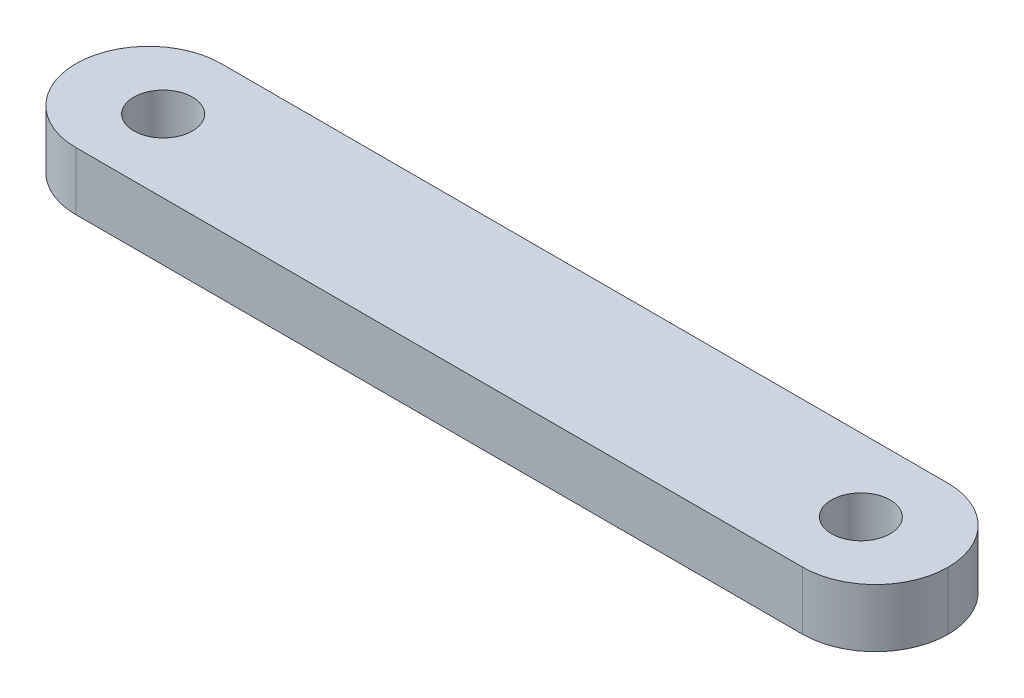
ISO-10303-21;
HEADER;
FILE_DESCRIPTION(('STEP AP214'),'2;1');
FILE_NAME('part.step','',(''),(''),'','','');
FILE_SCHEMA(('AUTOMOTIVE_DESIGN { 1 0 10303 214 1 1 1 1 }'));
ENDSEC;
DATA;
#1=APPLICATION_CONTEXT('core data for automotive mechanical design processes');
#2=APPLICATION_PROTOCOL_DEFINITION('international standard','automotive_design',2000,#1);
#3=PRODUCT_CONTEXT('',#1,'mechanical');
#4=PRODUCT('Part','Part','',(#3));
#5=PRODUCT_RELATED_PRODUCT_CATEGORY('part','',(#4));
#6=PRODUCT_DEFINITION_FORMATION('','',#4);
#7=PRODUCT_DEFINITION_CONTEXT('part definition',#1,'design');
#8=PRODUCT_DEFINITION('design','',#6,#7);
#9=PRODUCT_DEFINITION_SHAPE('','',#8);
#10=(LENGTH_UNIT() NAMED_UNIT(*) SI_UNIT(.MILLI.,.METRE.));
#11=(NAMED_UNIT(*) PLANE_ANGLE_UNIT() SI_UNIT($,.RADIAN.));
#12=(NAMED_UNIT(*) SI_UNIT($,.STERADIAN.) SOLID_ANGLE_UNIT());
#13=UNCERTAINTY_MEASURE_WITH_UNIT(LENGTH_MEASURE(1.E-05),#10,'distance_accuracy_value','');
#14=(GEOMETRIC_REPRESENTATION_CONTEXT(3) GLOBAL_UNCERTAINTY_ASSIGNED_CONTEXT((#13)) GLOBAL_UNIT_ASSIGNED_CONTEXT((#10,
#11,#12)) REPRESENTATION_CONTEXT('',''));
#15=CARTESIAN_POINT('',(0.,0.,0.));
#16=DIRECTION('',(0.,0.,1.));
#17=DIRECTION('',(1.,0.,0.));
#18=AXIS2_PLACEMENT_3D('',#15,#16,#17);
#19=CARTESIAN_POINT('',(-75.,10.,12.5));
#20=DIRECTION('',(0.,0.,-1.));
#21=DIRECTION('',(-1.,0.,0.));
#22=AXIS2_PLACEMENT_3D('',#19,#20,#21);
#23=PLANE('',#22);
#24=DIRECTION('',(1.,0.,0.));
#25=VECTOR('',#24,1.);
#26=CARTESIAN_POINT('',(-75.,0.,12.5));
#27=LINE('',#26,#25);
#28=CARTESIAN_POINT('',(-62.5,0.,12.5));
#29=VERTEX_POINT('',#28);
#30=CARTESIAN_POINT('',(62.5,0.,12.5));
#31=VERTEX_POINT('',#30);
#32=EDGE_CURVE('E94',#29,#31,#27,.T.);
#33=ORIENTED_EDGE('',*,*,#32,.T.);
#34=DIRECTION('',(0.,-1.,0.));
#35=VECTOR('',#34,1.);
#36=CARTESIAN_POINT('',(62.5,10.,12.5));
#37=LINE('',#36,#35);
#38=CARTESIAN_POINT('',(62.5,10.,12.5));
#39=VERTEX_POINT('',#38);
#40=EDGE_CURVE('E126',#31,#39,#37,.F.);
#41=ORIENTED_EDGE('',*,*,#40,.T.);
#42=DIRECTION('',(1.,0.,0.));
#43=VECTOR('',#42,1.);
#44=CARTESIAN_POINT('',(-75.,10.,12.5));
#45=LINE('',#44,#43);
#46=CARTESIAN_POINT('',(-62.5,10.,12.5));
#47=VERTEX_POINT('',#46);
#48=EDGE_CURVE('E136',#47,#39,#45,.T.);
#49=ORIENTED_EDGE('',*,*,#48,.F.);
#50=DIRECTION('',(0.,-1.,0.));
#51=VECTOR('',#50,1.);
#52=CARTESIAN_POINT('',(-62.5,10.,12.5));
#53=LINE('',#52,#51);
#54=EDGE_CURVE('E129',#47,#29,#53,.T.);
#55=ORIENTED_EDGE('',*,*,#54,.T.);
#56=EDGE_LOOP('',(#33,#41,#49,#55));
#57=FACE_BOUND('',#56,.T.);
#58=ADVANCED_FACE('F35',(#57),#23,.F.);
#59=CARTESIAN_POINT('',(-75.,10.,-12.5));
#60=DIRECTION('',(0.,0.,1.));
#61=DIRECTION('',(1.,0.,0.));
#62=AXIS2_PLACEMENT_3D('',#59,#60,#61);
#63=PLANE('',#62);
#64=DIRECTION('',(-1.,0.,0.));
#65=VECTOR('',#64,1.);
#66=CARTESIAN_POINT('',(-75.,10.,-12.5));
#67=LINE('',#66,#65);
#68=CARTESIAN_POINT('',(62.5,10.,-12.5));
#69=VERTEX_POINT('',#68);
#70=CARTESIAN_POINT('',(-62.5,10.,-12.5));
#71=VERTEX_POINT('',#70);
#72=EDGE_CURVE('E105',#69,#71,#67,.T.);
#73=ORIENTED_EDGE('',*,*,#72,.F.);
#74=DIRECTION('',(0.,-1.,0.));
#75=VECTOR('',#74,1.);
#76=CARTESIAN_POINT('',(62.5,10.,-12.5));
#77=LINE('',#76,#75);
#78=CARTESIAN_POINT('',(62.5,0.,-12.5));
#79=VERTEX_POINT('',#78);
#80=EDGE_CURVE('E11',#69,#79,#77,.T.);
#81=ORIENTED_EDGE('',*,*,#80,.T.);
#82=DIRECTION('',(-1.,0.,0.));
#83=VECTOR('',#82,1.);
#84=CARTESIAN_POINT('',(-75.,0.,-12.5));
#85=LINE('',#84,#83);
#86=CARTESIAN_POINT('',(-62.5,0.,-12.5));
#87=VERTEX_POINT('',#86);
#88=EDGE_CURVE('E134',#79,#87,#85,.T.);
#89=ORIENTED_EDGE('',*,*,#88,.T.);
#90=DIRECTION('',(0.,-1.,0.));
#91=VECTOR('',#90,1.);
#92=CARTESIAN_POINT('',(-62.5,10.,-12.5));
#93=LINE('',#92,#91);
#94=EDGE_CURVE('E44',#87,#71,#93,.F.);
#95=ORIENTED_EDGE('',*,*,#94,.T.);
#96=EDGE_LOOP('',(#73,#81,#89,#95));
#97=FACE_BOUND('',#96,.T.);
#98=ADVANCED_FACE('F166',(#97),#63,.F.);
#99=CARTESIAN_POINT('',(0.,10.,0.));
#100=DIRECTION('',(0.,1.,0.));
#101=DIRECTION('',(0.,0.,1.));
#102=AXIS2_PLACEMENT_3D('',#99,#100,#101);
#103=PLANE('',#102);
#104=CARTESIAN_POINT('',(60.,10.,0.));
#105=DIRECTION('',(0.,-1.,0.));
#106=DIRECTION('',(0.,0.,1.));
#107=AXIS2_PLACEMENT_3D('',#104,#105,#106);
#108=CIRCLE('',#107,5.05);
#109=CARTESIAN_POINT('',(60.,10.,5.05));
#110=VERTEX_POINT('',#109);
#111=EDGE_CURVE('E111',#110,#110,#108,.T.);
#112=ORIENTED_EDGE('',*,*,#111,.T.);
#113=EDGE_LOOP('',(#112));
#114=FACE_BOUND('',#113,.T.);
#115=CARTESIAN_POINT('',(-60.,10.,0.));
#116=DIRECTION('',(0.,1.,0.));
#117=DIRECTION('',(0.,0.,1.));
#118=AXIS2_PLACEMENT_3D('',#115,#116,#117);
#119=CIRCLE('',#118,5.05);
#120=CARTESIAN_POINT('',(-60.,10.,5.05));
#121=VERTEX_POINT('',#120);
#122=EDGE_CURVE('E142',#121,#121,#119,.T.);
#123=ORIENTED_EDGE('',*,*,#122,.F.);
#124=EDGE_LOOP('',(#123));
#125=FACE_BOUND('',#124,.T.);
#126=ORIENTED_EDGE('',*,*,#48,.T.);
#127=CARTESIAN_POINT('',(62.5,10.,0.));
#128=DIRECTION('',(0.,1.,0.));
#129=DIRECTION('',(0.,0.,1.));
#130=AXIS2_PLACEMENT_3D('',#127,#128,#129);
#131=CIRCLE('',#130,12.5);
#132=CARTESIAN_POINT('',(75.,10.,0.));
#133=VERTEX_POINT('',#132);
#134=EDGE_CURVE('E120',#39,#133,#131,.T.);
#135=ORIENTED_EDGE('',*,*,#134,.T.);
#136=CARTESIAN_POINT('',(62.5,10.,0.));
#137=DIRECTION('',(0.,1.,0.));
#138=DIRECTION('',(0.,0.,1.));
#139=AXIS2_PLACEMENT_3D('',#136,#137,#138);
#140=CIRCLE('',#139,12.5);
#141=EDGE_CURVE('E58',#133,#69,#140,.T.);
#142=ORIENTED_EDGE('',*,*,#141,.T.);
#143=ORIENTED_EDGE('',*,*,#72,.T.);
#144=CARTESIAN_POINT('',(-62.5,10.,0.));
#145=DIRECTION('',(0.,1.,0.));
#146=DIRECTION('',(0.,0.,1.));
#147=AXIS2_PLACEMENT_3D('',#144,#145,#146);
#148=CIRCLE('',#147,12.5);
#149=CARTESIAN_POINT('',(-75.,10.,0.));
#150=VERTEX_POINT('',#149);
#151=EDGE_CURVE('E124',#71,#150,#148,.T.);
#152=ORIENTED_EDGE('',*,*,#151,.T.);
#153=CARTESIAN_POINT('',(-62.5,10.,0.));
#154=DIRECTION('',(0.,1.,0.));
#155=DIRECTION('',(0.,0.,1.));
#156=AXIS2_PLACEMENT_3D('',#153,#154,#155);
#157=CIRCLE('',#156,12.5);
#158=EDGE_CURVE('E108',#150,#47,#157,.T.);
#159=ORIENTED_EDGE('',*,*,#158,.T.);
#160=EDGE_LOOP('',(#126,#135,#142,#143,#152,#159));
#161=FACE_BOUND('',#160,.T.);
#162=ADVANCED_FACE('F156',(#114,#125,#161),#103,.T.);
#163=CARTESIAN_POINT('',(0.,0.,0.));
#164=DIRECTION('',(0.,1.,0.));
#165=DIRECTION('',(0.,0.,1.));
#166=AXIS2_PLACEMENT_3D('',#163,#164,#165);
#167=PLANE('',#166);
#168=CARTESIAN_POINT('',(60.,0.,0.));
#169=DIRECTION('',(0.,-1.,0.));
#170=DIRECTION('',(0.,0.,1.));
#171=AXIS2_PLACEMENT_3D('',#168,#169,#170);
#172=CIRCLE('',#171,5.05);
#173=CARTESIAN_POINT('',(60.,0.,5.05));
#174=VERTEX_POINT('',#173);
#175=EDGE_CURVE('E116',#174,#174,#172,.T.);
#176=ORIENTED_EDGE('',*,*,#175,.F.);
#177=EDGE_LOOP('',(#176));
#178=FACE_BOUND('',#177,.T.);
#179=CARTESIAN_POINT('',(-60.,0.,0.));
#180=DIRECTION('',(0.,1.,0.));
#181=DIRECTION('',(0.,0.,1.));
#182=AXIS2_PLACEMENT_3D('',#179,#180,#181);
#183=CIRCLE('',#182,5.05);
#184=CARTESIAN_POINT('',(-60.,0.,5.05));
#185=VERTEX_POINT('',#184);
#186=EDGE_CURVE('E138',#185,#185,#183,.T.);
#187=ORIENTED_EDGE('',*,*,#186,.T.);
#188=EDGE_LOOP('',(#187));
#189=FACE_BOUND('',#188,.T.);
#190=CARTESIAN_POINT('',(62.5,0.,0.));
#191=DIRECTION('',(0.,1.,0.));
#192=DIRECTION('',(0.,0.,1.));
#193=AXIS2_PLACEMENT_3D('',#190,#191,#192);
#194=CIRCLE('',#193,12.5);
#195=CARTESIAN_POINT('',(75.,0.,0.));
#196=VERTEX_POINT('',#195);
#197=EDGE_CURVE('E99',#79,#196,#194,.F.);
#198=ORIENTED_EDGE('',*,*,#197,.T.);
#199=CARTESIAN_POINT('',(62.5,0.,0.));
#200=DIRECTION('',(0.,1.,0.));
#201=DIRECTION('',(0.,0.,1.));
#202=AXIS2_PLACEMENT_3D('',#199,#200,#201);
#203=CIRCLE('',#202,12.5);
#204=EDGE_CURVE('E131',#196,#31,#203,.F.);
#205=ORIENTED_EDGE('',*,*,#204,.T.);
#206=ORIENTED_EDGE('',*,*,#32,.F.);
#207=CARTESIAN_POINT('',(-62.5,0.,0.));
#208=DIRECTION('',(0.,1.,0.));
#209=DIRECTION('',(0.,0.,1.));
#210=AXIS2_PLACEMENT_3D('',#207,#208,#209);
#211=CIRCLE('',#210,12.5);
#212=CARTESIAN_POINT('',(-75.,0.,0.));
#213=VERTEX_POINT('',#212);
#214=EDGE_CURVE('E88',#29,#213,#211,.F.);
#215=ORIENTED_EDGE('',*,*,#214,.T.);
#216=CARTESIAN_POINT('',(-62.5,0.,0.));
#217=DIRECTION('',(0.,1.,0.));
#218=DIRECTION('',(0.,0.,1.));
#219=AXIS2_PLACEMENT_3D('',#216,#217,#218);
#220=CIRCLE('',#219,12.5);
#221=EDGE_CURVE('E92',#213,#87,#220,.F.);
#222=ORIENTED_EDGE('',*,*,#221,.T.);
#223=ORIENTED_EDGE('',*,*,#88,.F.);
#224=EDGE_LOOP('',(#198,#205,#206,#215,#222,#223));
#225=FACE_BOUND('',#224,.T.);
#226=ADVANCED_FACE('F90',(#178,#189,#225),#167,.F.);
#227=CARTESIAN_POINT('',(-60.,0.,0.));
#228=DIRECTION('',(0.,1.,0.));
#229=DIRECTION('',(0.,0.,1.));
#230=AXIS2_PLACEMENT_3D('',#227,#228,#229);
#231=CYLINDRICAL_SURFACE('',#230,5.05);
#232=ORIENTED_EDGE('',*,*,#186,.F.);
#233=EDGE_LOOP('',(#232));
#234=FACE_BOUND('',#233,.T.);
#235=ORIENTED_EDGE('',*,*,#122,.T.);
#236=EDGE_LOOP('',(#235));
#237=FACE_BOUND('',#236,.T.);
#238=ADVANCED_FACE('F155',(#234,#237),#231,.F.);
#239=CARTESIAN_POINT('',(60.,0.,0.));
#240=DIRECTION('',(0.,1.,0.));
#241=DIRECTION('',(0.,0.,1.));
#242=AXIS2_PLACEMENT_3D('',#239,#240,#241);
#243=CYLINDRICAL_SURFACE('',#242,5.05);
#244=ORIENTED_EDGE('',*,*,#175,.T.);
#245=EDGE_LOOP('',(#244));
#246=FACE_BOUND('',#245,.T.);
#247=ORIENTED_EDGE('',*,*,#111,.F.);
#248=EDGE_LOOP('',(#247));
#249=FACE_BOUND('',#248,.T.);
#250=ADVANCED_FACE('F150',(#246,#249),#243,.F.);
#251=CARTESIAN_POINT('',(62.5,10.,0.));
#252=DIRECTION('',(0.,-1.,0.));
#253=DIRECTION('',(0.,0.,-1.));
#254=AXIS2_PLACEMENT_3D('',#251,#252,#253);
#255=CYLINDRICAL_SURFACE('',#254,12.5);
#256=ORIENTED_EDGE('',*,*,#80,.F.);
#257=ORIENTED_EDGE('',*,*,#141,.F.);
#258=DIRECTION('',(0.,-1.,0.));
#259=VECTOR('',#258,1.);
#260=CARTESIAN_POINT('',(75.,10.,0.));
#261=LINE('',#260,#259);
#262=EDGE_CURVE('E109',#196,#133,#261,.F.);
#263=ORIENTED_EDGE('',*,*,#262,.F.);
#264=ORIENTED_EDGE('',*,*,#197,.F.);
#265=EDGE_LOOP('',(#256,#257,#263,#264));
#266=FACE_BOUND('',#265,.T.);
#267=ADVANCED_FACE('F176',(#266),#255,.T.);
#268=CARTESIAN_POINT('',(62.5,10.,0.));
#269=DIRECTION('',(0.,-1.,0.));
#270=DIRECTION('',(0.,0.,-1.));
#271=AXIS2_PLACEMENT_3D('',#268,#269,#270);
#272=CYLINDRICAL_SURFACE('',#271,12.5);
#273=ORIENTED_EDGE('',*,*,#134,.F.);
#274=ORIENTED_EDGE('',*,*,#40,.F.);
#275=ORIENTED_EDGE('',*,*,#204,.F.);
#276=ORIENTED_EDGE('',*,*,#262,.T.);
#277=EDGE_LOOP('',(#273,#274,#275,#276));
#278=FACE_BOUND('',#277,.T.);
#279=ADVANCED_FACE('F172',(#278),#272,.T.);
#280=CARTESIAN_POINT('',(-62.5,10.,0.));
#281=DIRECTION('',(0.,-1.,0.));
#282=DIRECTION('',(0.,0.,-1.));
#283=AXIS2_PLACEMENT_3D('',#280,#281,#282);
#284=CYLINDRICAL_SURFACE('',#283,12.5);
#285=DIRECTION('',(0.,-1.,0.));
#286=VECTOR('',#285,1.);
#287=CARTESIAN_POINT('',(-75.,10.,0.));
#288=LINE('',#287,#286);
#289=EDGE_CURVE('E39',#150,#213,#288,.T.);
#290=ORIENTED_EDGE('',*,*,#289,.F.);
#291=ORIENTED_EDGE('',*,*,#151,.F.);
#292=ORIENTED_EDGE('',*,*,#94,.F.);
#293=ORIENTED_EDGE('',*,*,#221,.F.);
#294=EDGE_LOOP('',(#290,#291,#292,#293));
#295=FACE_BOUND('',#294,.T.);
#296=ADVANCED_FACE('F37',(#295),#284,.T.);
#297=CARTESIAN_POINT('',(-62.5,10.,0.));
#298=DIRECTION('',(0.,-1.,0.));
#299=DIRECTION('',(0.,0.,-1.));
#300=AXIS2_PLACEMENT_3D('',#297,#298,#299);
#301=CYLINDRICAL_SURFACE('',#300,12.5);
#302=ORIENTED_EDGE('',*,*,#158,.F.);
#303=ORIENTED_EDGE('',*,*,#289,.T.);
#304=ORIENTED_EDGE('',*,*,#214,.F.);
#305=ORIENTED_EDGE('',*,*,#54,.F.);
#306=EDGE_LOOP('',(#302,#303,#304,#305));
#307=FACE_BOUND('',#306,.T.);
#308=ADVANCED_FACE('F107',(#307),#301,.T.);
#309=CLOSED_SHELL('',(#58,#98,#162,#226,#238,#250,#267,#279,#296,#308));
#310=MANIFOLD_SOLID_BREP('B2',#309);
#311=ADVANCED_BREP_SHAPE_REPRESENTATION('',(#18,#310),#14);
#312=SHAPE_DEFINITION_REPRESENTATION(#9,#311);
ENDSEC;
END-ISO-10303-21;
